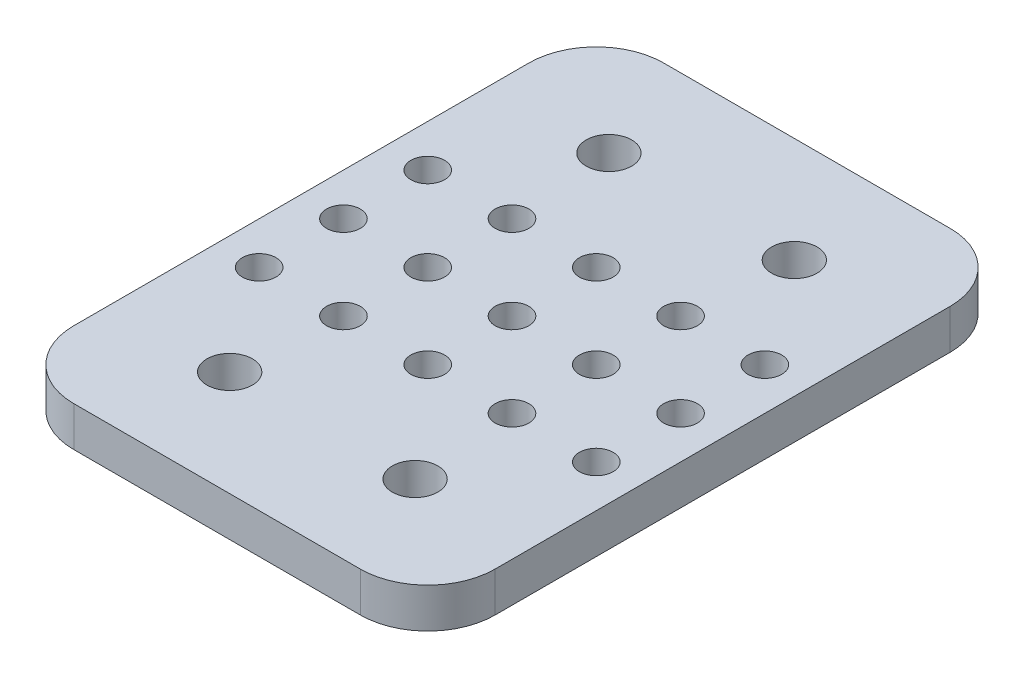
ISO-10303-21;
HEADER;
FILE_DESCRIPTION(('STEP AP214'),'2;1');
FILE_NAME('part.step','',(''),(''),'','','');
FILE_SCHEMA(('AUTOMOTIVE_DESIGN { 1 0 10303 214 1 1 1 1 }'));
ENDSEC;
DATA;
#1=APPLICATION_CONTEXT('core data for automotive mechanical design processes');
#2=APPLICATION_PROTOCOL_DEFINITION('international standard','automotive_design',2000,#1);
#3=PRODUCT_CONTEXT('',#1,'mechanical');
#4=PRODUCT('Part','Part','',(#3));
#5=PRODUCT_RELATED_PRODUCT_CATEGORY('part','',(#4));
#6=PRODUCT_DEFINITION_FORMATION('','',#4);
#7=PRODUCT_DEFINITION_CONTEXT('part definition',#1,'design');
#8=PRODUCT_DEFINITION('design','',#6,#7);
#9=PRODUCT_DEFINITION_SHAPE('','',#8);
#10=(LENGTH_UNIT() NAMED_UNIT(*) SI_UNIT(.MILLI.,.METRE.));
#11=(NAMED_UNIT(*) PLANE_ANGLE_UNIT() SI_UNIT($,.RADIAN.));
#12=(NAMED_UNIT(*) SI_UNIT($,.STERADIAN.) SOLID_ANGLE_UNIT());
#13=UNCERTAINTY_MEASURE_WITH_UNIT(LENGTH_MEASURE(1.E-05),#10,'distance_accuracy_value','');
#14=(GEOMETRIC_REPRESENTATION_CONTEXT(3) GLOBAL_UNCERTAINTY_ASSIGNED_CONTEXT((#13)) GLOBAL_UNIT_ASSIGNED_CONTEXT((#10,
#11,#12)) REPRESENTATION_CONTEXT('',''));
#15=CARTESIAN_POINT('',(0.,0.,0.));
#16=DIRECTION('',(0.,0.,1.));
#17=DIRECTION('',(1.,0.,0.));
#18=AXIS2_PLACEMENT_3D('',#15,#16,#17);
#19=CARTESIAN_POINT('',(0.,6.,0.));
#20=DIRECTION('',(0.,-1.,0.));
#21=DIRECTION('',(0.,0.,-1.));
#22=AXIS2_PLACEMENT_3D('',#19,#20,#21);
#23=PLANE('',#22);
#24=CARTESIAN_POINT('',(44.45,6.,-57.15));
#25=DIRECTION('',(0.,1.,0.));
#26=DIRECTION('',(0.,0.,1.));
#27=AXIS2_PLACEMENT_3D('',#24,#25,#26);
#28=CIRCLE('',#27,2.54);
#29=CARTESIAN_POINT('',(44.45,6.,-54.61));
#30=VERTEX_POINT('',#29);
#31=EDGE_CURVE('E239',#30,#30,#28,.T.);
#32=ORIENTED_EDGE('',*,*,#31,.F.);
#33=EDGE_LOOP('',(#32));
#34=FACE_BOUND('',#33,.T.);
#35=CARTESIAN_POINT('',(44.45,6.,-44.45));
#36=DIRECTION('',(0.,1.,0.));
#37=DIRECTION('',(0.,0.,1.));
#38=AXIS2_PLACEMENT_3D('',#35,#36,#37);
#39=CIRCLE('',#38,2.54);
#40=CARTESIAN_POINT('',(44.45,6.,-41.91));
#41=VERTEX_POINT('',#40);
#42=EDGE_CURVE('E233',#41,#41,#39,.T.);
#43=ORIENTED_EDGE('',*,*,#42,.F.);
#44=EDGE_LOOP('',(#43));
#45=FACE_BOUND('',#44,.T.);
#46=CARTESIAN_POINT('',(57.15,6.,-44.45));
#47=DIRECTION('',(0.,1.,0.));
#48=DIRECTION('',(0.,0.,1.));
#49=AXIS2_PLACEMENT_3D('',#46,#47,#48);
#50=CIRCLE('',#49,2.54);
#51=CARTESIAN_POINT('',(57.15,6.,-41.91));
#52=VERTEX_POINT('',#51);
#53=EDGE_CURVE('E227',#52,#52,#50,.T.);
#54=ORIENTED_EDGE('',*,*,#53,.F.);
#55=EDGE_LOOP('',(#54));
#56=FACE_BOUND('',#55,.T.);
#57=CARTESIAN_POINT('',(57.15,6.,-31.75));
#58=DIRECTION('',(0.,1.,0.));
#59=DIRECTION('',(0.,0.,1.));
#60=AXIS2_PLACEMENT_3D('',#57,#58,#59);
#61=CIRCLE('',#60,2.54);
#62=CARTESIAN_POINT('',(57.15,6.,-29.21));
#63=VERTEX_POINT('',#62);
#64=EDGE_CURVE('E220',#63,#63,#61,.T.);
#65=ORIENTED_EDGE('',*,*,#64,.F.);
#66=EDGE_LOOP('',(#65));
#67=FACE_BOUND('',#66,.T.);
#68=CARTESIAN_POINT('',(44.45,6.,-31.75));
#69=DIRECTION('',(0.,1.,0.));
#70=DIRECTION('',(0.,0.,1.));
#71=AXIS2_PLACEMENT_3D('',#68,#69,#70);
#72=CIRCLE('',#71,2.54);
#73=CARTESIAN_POINT('',(44.45,6.,-29.21));
#74=VERTEX_POINT('',#73);
#75=EDGE_CURVE('E221',#74,#74,#72,.T.);
#76=ORIENTED_EDGE('',*,*,#75,.F.);
#77=EDGE_LOOP('',(#76));
#78=FACE_BOUND('',#77,.T.);
#79=CARTESIAN_POINT('',(57.15,6.,-57.15));
#80=DIRECTION('',(0.,1.,0.));
#81=DIRECTION('',(0.,0.,1.));
#82=AXIS2_PLACEMENT_3D('',#79,#80,#81);
#83=CIRCLE('',#82,2.54);
#84=CARTESIAN_POINT('',(57.15,6.,-54.61));
#85=VERTEX_POINT('',#84);
#86=EDGE_CURVE('E246',#85,#85,#83,.T.);
#87=ORIENTED_EDGE('',*,*,#86,.F.);
#88=EDGE_LOOP('',(#87));
#89=FACE_BOUND('',#88,.T.);
#90=CARTESIAN_POINT('',(6.35,6.,-44.45));
#91=DIRECTION('',(0.,1.,0.));
#92=DIRECTION('',(0.,0.,1.));
#93=AXIS2_PLACEMENT_3D('',#90,#91,#92);
#94=CIRCLE('',#93,2.54);
#95=CARTESIAN_POINT('',(6.35,6.,-41.91));
#96=VERTEX_POINT('',#95);
#97=EDGE_CURVE('E214',#96,#96,#94,.T.);
#98=ORIENTED_EDGE('',*,*,#97,.F.);
#99=EDGE_LOOP('',(#98));
#100=FACE_BOUND('',#99,.T.);
#101=CARTESIAN_POINT('',(6.35,6.,-57.15));
#102=DIRECTION('',(0.,1.,0.));
#103=DIRECTION('',(0.,0.,1.));
#104=AXIS2_PLACEMENT_3D('',#101,#102,#103);
#105=CIRCLE('',#104,2.54);
#106=CARTESIAN_POINT('',(6.35,6.,-54.61));
#107=VERTEX_POINT('',#106);
#108=EDGE_CURVE('E270',#107,#107,#105,.T.);
#109=ORIENTED_EDGE('',*,*,#108,.F.);
#110=EDGE_LOOP('',(#109));
#111=FACE_BOUND('',#110,.T.);
#112=CARTESIAN_POINT('',(19.05,6.,-57.15));
#113=DIRECTION('',(0.,1.,0.));
#114=DIRECTION('',(0.,0.,1.));
#115=AXIS2_PLACEMENT_3D('',#112,#113,#114);
#116=CIRCLE('',#115,2.54);
#117=CARTESIAN_POINT('',(19.05,6.,-54.61));
#118=VERTEX_POINT('',#117);
#119=EDGE_CURVE('E264',#118,#118,#116,.T.);
#120=ORIENTED_EDGE('',*,*,#119,.F.);
#121=EDGE_LOOP('',(#120));
#122=FACE_BOUND('',#121,.T.);
#123=CARTESIAN_POINT('',(19.05,6.,-44.45));
#124=DIRECTION('',(0.,1.,0.));
#125=DIRECTION('',(0.,0.,1.));
#126=AXIS2_PLACEMENT_3D('',#123,#124,#125);
#127=CIRCLE('',#126,2.54);
#128=CARTESIAN_POINT('',(19.05,6.,-41.91));
#129=VERTEX_POINT('',#128);
#130=EDGE_CURVE('E257',#129,#129,#127,.T.);
#131=ORIENTED_EDGE('',*,*,#130,.F.);
#132=EDGE_LOOP('',(#131));
#133=FACE_BOUND('',#132,.T.);
#134=CARTESIAN_POINT('',(19.05,6.,-31.75));
#135=DIRECTION('',(0.,1.,0.));
#136=DIRECTION('',(0.,0.,1.));
#137=AXIS2_PLACEMENT_3D('',#134,#135,#136);
#138=CIRCLE('',#137,2.54);
#139=CARTESIAN_POINT('',(19.05,6.,-29.21));
#140=VERTEX_POINT('',#139);
#141=EDGE_CURVE('E258',#140,#140,#138,.T.);
#142=ORIENTED_EDGE('',*,*,#141,.F.);
#143=EDGE_LOOP('',(#142));
#144=FACE_BOUND('',#143,.T.);
#145=CARTESIAN_POINT('',(31.75,6.,-31.75));
#146=DIRECTION('',(0.,1.,0.));
#147=DIRECTION('',(0.,0.,1.));
#148=AXIS2_PLACEMENT_3D('',#145,#146,#147);
#149=CIRCLE('',#148,2.54);
#150=CARTESIAN_POINT('',(31.75,6.,-29.21));
#151=VERTEX_POINT('',#150);
#152=EDGE_CURVE('E292',#151,#151,#149,.T.);
#153=ORIENTED_EDGE('',*,*,#152,.F.);
#154=EDGE_LOOP('',(#153));
#155=FACE_BOUND('',#154,.T.);
#156=CARTESIAN_POINT('',(31.75,6.,-44.45));
#157=DIRECTION('',(0.,1.,0.));
#158=DIRECTION('',(0.,0.,1.));
#159=AXIS2_PLACEMENT_3D('',#156,#157,#158);
#160=CIRCLE('',#159,2.54);
#161=CARTESIAN_POINT('',(31.75,6.,-41.91));
#162=VERTEX_POINT('',#161);
#163=EDGE_CURVE('E286',#162,#162,#160,.T.);
#164=ORIENTED_EDGE('',*,*,#163,.F.);
#165=EDGE_LOOP('',(#164));
#166=FACE_BOUND('',#165,.T.);
#167=CARTESIAN_POINT('',(31.75,6.,-57.15));
#168=DIRECTION('',(0.,1.,0.));
#169=DIRECTION('',(0.,0.,1.));
#170=AXIS2_PLACEMENT_3D('',#167,#168,#169);
#171=CIRCLE('',#170,2.54);
#172=CARTESIAN_POINT('',(31.75,6.,-54.61));
#173=VERTEX_POINT('',#172);
#174=EDGE_CURVE('E280',#173,#173,#171,.T.);
#175=ORIENTED_EDGE('',*,*,#174,.F.);
#176=EDGE_LOOP('',(#175));
#177=FACE_BOUND('',#176,.T.);
#178=CARTESIAN_POINT('',(6.35,6.,-31.75));
#179=DIRECTION('',(0.,1.,0.));
#180=DIRECTION('',(0.,0.,1.));
#181=AXIS2_PLACEMENT_3D('',#178,#179,#180);
#182=CIRCLE('',#181,2.54);
#183=CARTESIAN_POINT('',(6.35,6.,-29.21));
#184=VERTEX_POINT('',#183);
#185=EDGE_CURVE('E211',#184,#184,#182,.T.);
#186=ORIENTED_EDGE('',*,*,#185,.F.);
#187=EDGE_LOOP('',(#186));
#188=FACE_BOUND('',#187,.T.);
#189=DIRECTION('',(-1.,0.,0.));
#190=VECTOR('',#189,1.);
#191=CARTESIAN_POINT('',(0.,6.,-88.9));
#192=LINE('',#191,#190);
#193=CARTESIAN_POINT('',(53.34,6.,-88.9));
#194=VERTEX_POINT('',#193);
#195=CARTESIAN_POINT('',(10.16,6.,-88.9));
#196=VERTEX_POINT('',#195);
#197=EDGE_CURVE('E145',#194,#196,#192,.T.);
#198=ORIENTED_EDGE('',*,*,#197,.T.);
#199=CARTESIAN_POINT('',(10.16,6.,-78.74));
#200=DIRECTION('',(0.,-1.,0.));
#201=DIRECTION('',(0.,0.,-1.));
#202=AXIS2_PLACEMENT_3D('',#199,#200,#201);
#203=CIRCLE('',#202,10.16);
#204=CARTESIAN_POINT('',(0.,6.,-78.74));
#205=VERTEX_POINT('',#204);
#206=EDGE_CURVE('E164',#196,#205,#203,.F.);
#207=ORIENTED_EDGE('',*,*,#206,.T.);
#208=DIRECTION('',(0.,0.,1.));
#209=VECTOR('',#208,1.);
#210=CARTESIAN_POINT('',(0.,6.,0.));
#211=LINE('',#210,#209);
#212=CARTESIAN_POINT('',(0.,6.,-10.16));
#213=VERTEX_POINT('',#212);
#214=EDGE_CURVE('E128',#205,#213,#211,.T.);
#215=ORIENTED_EDGE('',*,*,#214,.T.);
#216=CARTESIAN_POINT('',(10.16,6.,-10.16));
#217=DIRECTION('',(0.,-1.,0.));
#218=DIRECTION('',(0.,0.,-1.));
#219=AXIS2_PLACEMENT_3D('',#216,#217,#218);
#220=CIRCLE('',#219,10.16);
#221=CARTESIAN_POINT('',(10.16,6.,0.));
#222=VERTEX_POINT('',#221);
#223=EDGE_CURVE('E159',#213,#222,#220,.F.);
#224=ORIENTED_EDGE('',*,*,#223,.T.);
#225=DIRECTION('',(1.,0.,0.));
#226=VECTOR('',#225,1.);
#227=CARTESIAN_POINT('',(0.,6.,0.));
#228=LINE('',#227,#226);
#229=CARTESIAN_POINT('',(53.34,6.,0.));
#230=VERTEX_POINT('',#229);
#231=EDGE_CURVE('E175',#222,#230,#228,.T.);
#232=ORIENTED_EDGE('',*,*,#231,.T.);
#233=CARTESIAN_POINT('',(53.34,6.,-10.16));
#234=DIRECTION('',(0.,-1.,0.));
#235=DIRECTION('',(0.,0.,-1.));
#236=AXIS2_PLACEMENT_3D('',#233,#234,#235);
#237=CIRCLE('',#236,10.16);
#238=CARTESIAN_POINT('',(63.5,6.,-10.16));
#239=VERTEX_POINT('',#238);
#240=EDGE_CURVE('E64',#230,#239,#237,.F.);
#241=ORIENTED_EDGE('',*,*,#240,.T.);
#242=DIRECTION('',(0.,0.,-1.));
#243=VECTOR('',#242,1.);
#244=CARTESIAN_POINT('',(63.5,6.,0.));
#245=LINE('',#244,#243);
#246=CARTESIAN_POINT('',(63.5,6.,-78.74));
#247=VERTEX_POINT('',#246);
#248=EDGE_CURVE('E183',#239,#247,#245,.T.);
#249=ORIENTED_EDGE('',*,*,#248,.T.);
#250=CARTESIAN_POINT('',(53.34,6.,-78.74));
#251=DIRECTION('',(0.,-1.,0.));
#252=DIRECTION('',(0.,0.,-1.));
#253=AXIS2_PLACEMENT_3D('',#250,#251,#252);
#254=CIRCLE('',#253,10.16);
#255=EDGE_CURVE('E162',#247,#194,#254,.F.);
#256=ORIENTED_EDGE('',*,*,#255,.T.);
#257=EDGE_LOOP('',(#198,#207,#215,#224,#232,#241,#249,#256));
#258=FACE_BOUND('',#257,.T.);
#259=CARTESIAN_POINT('',(17.78,6.,-73.025));
#260=DIRECTION('',(0.,1.,0.));
#261=DIRECTION('',(0.,0.,1.));
#262=AXIS2_PLACEMENT_3D('',#259,#260,#261);
#263=CIRCLE('',#262,3.42900000000001);
#264=CARTESIAN_POINT('',(17.78,6.,-69.596));
#265=VERTEX_POINT('',#264);
#266=EDGE_CURVE('E136',#265,#265,#263,.T.);
#267=ORIENTED_EDGE('',*,*,#266,.F.);
#268=EDGE_LOOP('',(#267));
#269=FACE_BOUND('',#268,.T.);
#270=CARTESIAN_POINT('',(45.72,6.,-15.875));
#271=DIRECTION('',(0.,1.,0.));
#272=DIRECTION('',(0.,0.,1.));
#273=AXIS2_PLACEMENT_3D('',#270,#271,#272);
#274=CIRCLE('',#273,3.429);
#275=CARTESIAN_POINT('',(45.72,6.,-12.446));
#276=VERTEX_POINT('',#275);
#277=EDGE_CURVE('E191',#276,#276,#274,.T.);
#278=ORIENTED_EDGE('',*,*,#277,.F.);
#279=EDGE_LOOP('',(#278));
#280=FACE_BOUND('',#279,.T.);
#281=CARTESIAN_POINT('',(17.78,6.,-15.875));
#282=DIRECTION('',(0.,1.,0.));
#283=DIRECTION('',(0.,0.,-1.));
#284=AXIS2_PLACEMENT_3D('',#281,#282,#283);
#285=CIRCLE('',#284,3.429);
#286=CARTESIAN_POINT('',(17.78,6.,-19.304));
#287=VERTEX_POINT('',#286);
#288=EDGE_CURVE('E196',#287,#287,#285,.T.);
#289=ORIENTED_EDGE('',*,*,#288,.F.);
#290=EDGE_LOOP('',(#289));
#291=FACE_BOUND('',#290,.T.);
#292=CARTESIAN_POINT('',(45.72,6.,-73.025));
#293=DIRECTION('',(0.,1.,0.));
#294=DIRECTION('',(0.,0.,-1.));
#295=AXIS2_PLACEMENT_3D('',#292,#293,#294);
#296=CIRCLE('',#295,3.42900000000001);
#297=CARTESIAN_POINT('',(45.72,6.,-76.454));
#298=VERTEX_POINT('',#297);
#299=EDGE_CURVE('E202',#298,#298,#296,.T.);
#300=ORIENTED_EDGE('',*,*,#299,.F.);
#301=EDGE_LOOP('',(#300));
#302=FACE_BOUND('',#301,.T.);
#303=ADVANCED_FACE('F42',(#34,#45,#56,#67,#78,#89,#100,#111,#122,#133,#144,#155,#166,#177,#188,
#258,#269,#280,#291,#302),#23,.F.);
#304=CARTESIAN_POINT('',(0.,0.,0.));
#305=DIRECTION('',(0.,-1.,0.));
#306=DIRECTION('',(0.,0.,-1.));
#307=AXIS2_PLACEMENT_3D('',#304,#305,#306);
#308=PLANE('',#307);
#309=CARTESIAN_POINT('',(44.45,0.,-57.15));
#310=DIRECTION('',(0.,1.,0.));
#311=DIRECTION('',(0.,0.,1.));
#312=AXIS2_PLACEMENT_3D('',#309,#310,#311);
#313=CIRCLE('',#312,2.54);
#314=CARTESIAN_POINT('',(44.45,0.,-54.61));
#315=VERTEX_POINT('',#314);
#316=EDGE_CURVE('E236',#315,#315,#313,.T.);
#317=ORIENTED_EDGE('',*,*,#316,.T.);
#318=EDGE_LOOP('',(#317));
#319=FACE_BOUND('',#318,.T.);
#320=CARTESIAN_POINT('',(44.45,0.,-44.45));
#321=DIRECTION('',(0.,1.,0.));
#322=DIRECTION('',(0.,0.,1.));
#323=AXIS2_PLACEMENT_3D('',#320,#321,#322);
#324=CIRCLE('',#323,2.54);
#325=CARTESIAN_POINT('',(44.45,0.,-41.91));
#326=VERTEX_POINT('',#325);
#327=EDGE_CURVE('E230',#326,#326,#324,.T.);
#328=ORIENTED_EDGE('',*,*,#327,.T.);
#329=EDGE_LOOP('',(#328));
#330=FACE_BOUND('',#329,.T.);
#331=CARTESIAN_POINT('',(57.15,0.,-44.45));
#332=DIRECTION('',(0.,1.,0.));
#333=DIRECTION('',(0.,0.,1.));
#334=AXIS2_PLACEMENT_3D('',#331,#332,#333);
#335=CIRCLE('',#334,2.54);
#336=CARTESIAN_POINT('',(57.15,0.,-41.91));
#337=VERTEX_POINT('',#336);
#338=EDGE_CURVE('E224',#337,#337,#335,.T.);
#339=ORIENTED_EDGE('',*,*,#338,.T.);
#340=EDGE_LOOP('',(#339));
#341=FACE_BOUND('',#340,.T.);
#342=CARTESIAN_POINT('',(57.15,0.,-31.75));
#343=DIRECTION('',(0.,1.,0.));
#344=DIRECTION('',(0.,0.,1.));
#345=AXIS2_PLACEMENT_3D('',#342,#343,#344);
#346=CIRCLE('',#345,2.54);
#347=CARTESIAN_POINT('',(57.15,0.,-29.21));
#348=VERTEX_POINT('',#347);
#349=EDGE_CURVE('E217',#348,#348,#346,.T.);
#350=ORIENTED_EDGE('',*,*,#349,.T.);
#351=EDGE_LOOP('',(#350));
#352=FACE_BOUND('',#351,.T.);
#353=CARTESIAN_POINT('',(44.45,0.,-31.75));
#354=DIRECTION('',(0.,1.,0.));
#355=DIRECTION('',(0.,0.,1.));
#356=AXIS2_PLACEMENT_3D('',#353,#354,#355);
#357=CIRCLE('',#356,2.54);
#358=CARTESIAN_POINT('',(44.45,0.,-29.21));
#359=VERTEX_POINT('',#358);
#360=EDGE_CURVE('E249',#359,#359,#357,.T.);
#361=ORIENTED_EDGE('',*,*,#360,.T.);
#362=EDGE_LOOP('',(#361));
#363=FACE_BOUND('',#362,.T.);
#364=CARTESIAN_POINT('',(57.15,0.,-57.15));
#365=DIRECTION('',(0.,1.,0.));
#366=DIRECTION('',(0.,0.,1.));
#367=AXIS2_PLACEMENT_3D('',#364,#365,#366);
#368=CIRCLE('',#367,2.54);
#369=CARTESIAN_POINT('',(57.15,0.,-54.61));
#370=VERTEX_POINT('',#369);
#371=EDGE_CURVE('E243',#370,#370,#368,.T.);
#372=ORIENTED_EDGE('',*,*,#371,.T.);
#373=EDGE_LOOP('',(#372));
#374=FACE_BOUND('',#373,.T.);
#375=CARTESIAN_POINT('',(6.35,0.,-44.45));
#376=DIRECTION('',(0.,1.,0.));
#377=DIRECTION('',(0.,0.,1.));
#378=AXIS2_PLACEMENT_3D('',#375,#376,#377);
#379=CIRCLE('',#378,2.54);
#380=CARTESIAN_POINT('',(6.35,0.,-41.91));
#381=VERTEX_POINT('',#380);
#382=EDGE_CURVE('E273',#381,#381,#379,.T.);
#383=ORIENTED_EDGE('',*,*,#382,.T.);
#384=EDGE_LOOP('',(#383));
#385=FACE_BOUND('',#384,.T.);
#386=CARTESIAN_POINT('',(6.35,0.,-57.15));
#387=DIRECTION('',(0.,1.,0.));
#388=DIRECTION('',(0.,0.,1.));
#389=AXIS2_PLACEMENT_3D('',#386,#387,#388);
#390=CIRCLE('',#389,2.54);
#391=CARTESIAN_POINT('',(6.35,0.,-54.61));
#392=VERTEX_POINT('',#391);
#393=EDGE_CURVE('E267',#392,#392,#390,.T.);
#394=ORIENTED_EDGE('',*,*,#393,.T.);
#395=EDGE_LOOP('',(#394));
#396=FACE_BOUND('',#395,.T.);
#397=CARTESIAN_POINT('',(19.05,0.,-57.15));
#398=DIRECTION('',(0.,1.,0.));
#399=DIRECTION('',(0.,0.,1.));
#400=AXIS2_PLACEMENT_3D('',#397,#398,#399);
#401=CIRCLE('',#400,2.54);
#402=CARTESIAN_POINT('',(19.05,0.,-54.61));
#403=VERTEX_POINT('',#402);
#404=EDGE_CURVE('E261',#403,#403,#401,.T.);
#405=ORIENTED_EDGE('',*,*,#404,.T.);
#406=EDGE_LOOP('',(#405));
#407=FACE_BOUND('',#406,.T.);
#408=CARTESIAN_POINT('',(19.05,0.,-44.45));
#409=DIRECTION('',(0.,1.,0.));
#410=DIRECTION('',(0.,0.,1.));
#411=AXIS2_PLACEMENT_3D('',#408,#409,#410);
#412=CIRCLE('',#411,2.54);
#413=CARTESIAN_POINT('',(19.05,0.,-41.91));
#414=VERTEX_POINT('',#413);
#415=EDGE_CURVE('E254',#414,#414,#412,.T.);
#416=ORIENTED_EDGE('',*,*,#415,.T.);
#417=EDGE_LOOP('',(#416));
#418=FACE_BOUND('',#417,.T.);
#419=CARTESIAN_POINT('',(19.05,0.,-31.75));
#420=DIRECTION('',(0.,1.,0.));
#421=DIRECTION('',(0.,0.,1.));
#422=AXIS2_PLACEMENT_3D('',#419,#420,#421);
#423=CIRCLE('',#422,2.54);
#424=CARTESIAN_POINT('',(19.05,0.,-29.21));
#425=VERTEX_POINT('',#424);
#426=EDGE_CURVE('E295',#425,#425,#423,.T.);
#427=ORIENTED_EDGE('',*,*,#426,.T.);
#428=EDGE_LOOP('',(#427));
#429=FACE_BOUND('',#428,.T.);
#430=CARTESIAN_POINT('',(31.75,0.,-31.75));
#431=DIRECTION('',(0.,1.,0.));
#432=DIRECTION('',(0.,0.,1.));
#433=AXIS2_PLACEMENT_3D('',#430,#431,#432);
#434=CIRCLE('',#433,2.54);
#435=CARTESIAN_POINT('',(31.75,0.,-29.21));
#436=VERTEX_POINT('',#435);
#437=EDGE_CURVE('E289',#436,#436,#434,.T.);
#438=ORIENTED_EDGE('',*,*,#437,.T.);
#439=EDGE_LOOP('',(#438));
#440=FACE_BOUND('',#439,.T.);
#441=CARTESIAN_POINT('',(31.75,0.,-44.45));
#442=DIRECTION('',(0.,1.,0.));
#443=DIRECTION('',(0.,0.,1.));
#444=AXIS2_PLACEMENT_3D('',#441,#442,#443);
#445=CIRCLE('',#444,2.54);
#446=CARTESIAN_POINT('',(31.75,0.,-41.91));
#447=VERTEX_POINT('',#446);
#448=EDGE_CURVE('E283',#447,#447,#445,.T.);
#449=ORIENTED_EDGE('',*,*,#448,.T.);
#450=EDGE_LOOP('',(#449));
#451=FACE_BOUND('',#450,.T.);
#452=CARTESIAN_POINT('',(31.75,0.,-57.15));
#453=DIRECTION('',(0.,1.,0.));
#454=DIRECTION('',(0.,0.,1.));
#455=AXIS2_PLACEMENT_3D('',#452,#453,#454);
#456=CIRCLE('',#455,2.54);
#457=CARTESIAN_POINT('',(31.75,0.,-54.61));
#458=VERTEX_POINT('',#457);
#459=EDGE_CURVE('E242',#458,#458,#456,.T.);
#460=ORIENTED_EDGE('',*,*,#459,.T.);
#461=EDGE_LOOP('',(#460));
#462=FACE_BOUND('',#461,.T.);
#463=CARTESIAN_POINT('',(6.35,0.,-31.75));
#464=DIRECTION('',(0.,1.,0.));
#465=DIRECTION('',(0.,0.,1.));
#466=AXIS2_PLACEMENT_3D('',#463,#464,#465);
#467=CIRCLE('',#466,2.54);
#468=CARTESIAN_POINT('',(6.35,0.,-29.21));
#469=VERTEX_POINT('',#468);
#470=EDGE_CURVE('E208',#469,#469,#467,.T.);
#471=ORIENTED_EDGE('',*,*,#470,.T.);
#472=EDGE_LOOP('',(#471));
#473=FACE_BOUND('',#472,.T.);
#474=CARTESIAN_POINT('',(17.78,0.,-15.875));
#475=DIRECTION('',(0.,1.,0.));
#476=DIRECTION('',(0.,0.,-1.));
#477=AXIS2_PLACEMENT_3D('',#474,#475,#476);
#478=CIRCLE('',#477,3.429);
#479=CARTESIAN_POINT('',(17.78,0.,-19.304));
#480=VERTEX_POINT('',#479);
#481=EDGE_CURVE('E199',#480,#480,#478,.T.);
#482=ORIENTED_EDGE('',*,*,#481,.T.);
#483=EDGE_LOOP('',(#482));
#484=FACE_BOUND('',#483,.T.);
#485=CARTESIAN_POINT('',(17.78,0.,-73.025));
#486=DIRECTION('',(0.,1.,0.));
#487=DIRECTION('',(0.,0.,1.));
#488=AXIS2_PLACEMENT_3D('',#485,#486,#487);
#489=CIRCLE('',#488,3.42900000000001);
#490=CARTESIAN_POINT('',(17.78,0.,-69.596));
#491=VERTEX_POINT('',#490);
#492=EDGE_CURVE('E142',#491,#491,#489,.T.);
#493=ORIENTED_EDGE('',*,*,#492,.T.);
#494=EDGE_LOOP('',(#493));
#495=FACE_BOUND('',#494,.T.);
#496=DIRECTION('',(0.,0.,1.));
#497=VECTOR('',#496,1.);
#498=CARTESIAN_POINT('',(0.,0.,0.));
#499=LINE('',#498,#497);
#500=CARTESIAN_POINT('',(0.,0.,-78.74));
#501=VERTEX_POINT('',#500);
#502=CARTESIAN_POINT('',(0.,0.,-10.16));
#503=VERTEX_POINT('',#502);
#504=EDGE_CURVE('E125',#501,#503,#499,.T.);
#505=ORIENTED_EDGE('',*,*,#504,.F.);
#506=CARTESIAN_POINT('',(10.16,0.,-78.74));
#507=DIRECTION('',(0.,-1.,0.));
#508=DIRECTION('',(0.,0.,-1.));
#509=AXIS2_PLACEMENT_3D('',#506,#507,#508);
#510=CIRCLE('',#509,10.16);
#511=CARTESIAN_POINT('',(10.16,0.,-88.9));
#512=VERTEX_POINT('',#511);
#513=EDGE_CURVE('E108',#501,#512,#510,.T.);
#514=ORIENTED_EDGE('',*,*,#513,.T.);
#515=DIRECTION('',(-1.,0.,0.));
#516=VECTOR('',#515,1.);
#517=CARTESIAN_POINT('',(0.,0.,-88.9));
#518=LINE('',#517,#516);
#519=CARTESIAN_POINT('',(53.34,0.,-88.9));
#520=VERTEX_POINT('',#519);
#521=EDGE_CURVE('E149',#520,#512,#518,.T.);
#522=ORIENTED_EDGE('',*,*,#521,.F.);
#523=CARTESIAN_POINT('',(53.34,0.,-78.74));
#524=DIRECTION('',(0.,-1.,0.));
#525=DIRECTION('',(0.,0.,-1.));
#526=AXIS2_PLACEMENT_3D('',#523,#524,#525);
#527=CIRCLE('',#526,10.16);
#528=CARTESIAN_POINT('',(63.5,0.,-78.74));
#529=VERTEX_POINT('',#528);
#530=EDGE_CURVE('E119',#520,#529,#527,.T.);
#531=ORIENTED_EDGE('',*,*,#530,.T.);
#532=DIRECTION('',(0.,0.,-1.));
#533=VECTOR('',#532,1.);
#534=CARTESIAN_POINT('',(63.5,0.,0.));
#535=LINE('',#534,#533);
#536=CARTESIAN_POINT('',(63.5,0.,-10.16));
#537=VERTEX_POINT('',#536);
#538=EDGE_CURVE('E139',#537,#529,#535,.T.);
#539=ORIENTED_EDGE('',*,*,#538,.F.);
#540=CARTESIAN_POINT('',(53.34,0.,-10.16));
#541=DIRECTION('',(0.,-1.,0.));
#542=DIRECTION('',(0.,0.,-1.));
#543=AXIS2_PLACEMENT_3D('',#540,#541,#542);
#544=CIRCLE('',#543,10.16);
#545=CARTESIAN_POINT('',(53.34,0.,0.));
#546=VERTEX_POINT('',#545);
#547=EDGE_CURVE('E153',#537,#546,#544,.T.);
#548=ORIENTED_EDGE('',*,*,#547,.T.);
#549=DIRECTION('',(1.,0.,0.));
#550=VECTOR('',#549,1.);
#551=CARTESIAN_POINT('',(0.,0.,0.));
#552=LINE('',#551,#550);
#553=CARTESIAN_POINT('',(10.16,0.,0.));
#554=VERTEX_POINT('',#553);
#555=EDGE_CURVE('E135',#554,#546,#552,.T.);
#556=ORIENTED_EDGE('',*,*,#555,.F.);
#557=CARTESIAN_POINT('',(10.16,0.,-10.16));
#558=DIRECTION('',(0.,-1.,0.));
#559=DIRECTION('',(0.,0.,-1.));
#560=AXIS2_PLACEMENT_3D('',#557,#558,#559);
#561=CIRCLE('',#560,10.16);
#562=EDGE_CURVE('E129',#554,#503,#561,.T.);
#563=ORIENTED_EDGE('',*,*,#562,.T.);
#564=EDGE_LOOP('',(#505,#514,#522,#531,#539,#548,#556,#563));
#565=FACE_BOUND('',#564,.T.);
#566=CARTESIAN_POINT('',(45.72,0.,-15.875));
#567=DIRECTION('',(0.,1.,0.));
#568=DIRECTION('',(0.,0.,1.));
#569=AXIS2_PLACEMENT_3D('',#566,#567,#568);
#570=CIRCLE('',#569,3.429);
#571=CARTESIAN_POINT('',(45.72,0.,-12.446));
#572=VERTEX_POINT('',#571);
#573=EDGE_CURVE('E193',#572,#572,#570,.T.);
#574=ORIENTED_EDGE('',*,*,#573,.T.);
#575=EDGE_LOOP('',(#574));
#576=FACE_BOUND('',#575,.T.);
#577=CARTESIAN_POINT('',(45.72,0.,-73.025));
#578=DIRECTION('',(0.,1.,0.));
#579=DIRECTION('',(0.,0.,-1.));
#580=AXIS2_PLACEMENT_3D('',#577,#578,#579);
#581=CIRCLE('',#580,3.42900000000001);
#582=CARTESIAN_POINT('',(45.72,0.,-76.454));
#583=VERTEX_POINT('',#582);
#584=EDGE_CURVE('E205',#583,#583,#581,.T.);
#585=ORIENTED_EDGE('',*,*,#584,.T.);
#586=EDGE_LOOP('',(#585));
#587=FACE_BOUND('',#586,.T.);
#588=ADVANCED_FACE('F132',(#319,#330,#341,#352,#363,#374,#385,#396,#407,#418,#429,#440,#451,
#462,#473,#484,#495,#565,#576,#587),#308,.T.);
#589=CARTESIAN_POINT('',(0.,6.,0.));
#590=DIRECTION('',(1.,0.,0.));
#591=DIRECTION('',(0.,0.,-1.));
#592=AXIS2_PLACEMENT_3D('',#589,#590,#591);
#593=PLANE('',#592);
#594=ORIENTED_EDGE('',*,*,#214,.F.);
#595=DIRECTION('',(0.,-1.,0.));
#596=VECTOR('',#595,1.);
#597=CARTESIAN_POINT('',(0.,6.,-78.74));
#598=LINE('',#597,#596);
#599=EDGE_CURVE('E112',#205,#501,#598,.T.);
#600=ORIENTED_EDGE('',*,*,#599,.T.);
#601=ORIENTED_EDGE('',*,*,#504,.T.);
#602=DIRECTION('',(0.,-1.,0.));
#603=VECTOR('',#602,1.);
#604=CARTESIAN_POINT('',(0.,6.,-10.16));
#605=LINE('',#604,#603);
#606=EDGE_CURVE('E130',#503,#213,#605,.F.);
#607=ORIENTED_EDGE('',*,*,#606,.T.);
#608=EDGE_LOOP('',(#594,#600,#601,#607));
#609=FACE_BOUND('',#608,.T.);
#610=ADVANCED_FACE('F124',(#609),#593,.F.);
#611=CARTESIAN_POINT('',(0.,6.,0.));
#612=DIRECTION('',(0.,0.,-1.));
#613=DIRECTION('',(-1.,0.,0.));
#614=AXIS2_PLACEMENT_3D('',#611,#612,#613);
#615=PLANE('',#614);
#616=ORIENTED_EDGE('',*,*,#555,.T.);
#617=DIRECTION('',(0.,-1.,0.));
#618=VECTOR('',#617,1.);
#619=CARTESIAN_POINT('',(53.34,6.,0.));
#620=LINE('',#619,#618);
#621=EDGE_CURVE('E12',#546,#230,#620,.F.);
#622=ORIENTED_EDGE('',*,*,#621,.T.);
#623=ORIENTED_EDGE('',*,*,#231,.F.);
#624=DIRECTION('',(0.,-1.,0.));
#625=VECTOR('',#624,1.);
#626=CARTESIAN_POINT('',(10.16,6.,0.));
#627=LINE('',#626,#625);
#628=EDGE_CURVE('E50',#222,#554,#627,.T.);
#629=ORIENTED_EDGE('',*,*,#628,.T.);
#630=EDGE_LOOP('',(#616,#622,#623,#629));
#631=FACE_BOUND('',#630,.T.);
#632=ADVANCED_FACE('F173',(#631),#615,.F.);
#633=CARTESIAN_POINT('',(63.5,6.,0.));
#634=DIRECTION('',(-1.,0.,0.));
#635=DIRECTION('',(0.,0.,1.));
#636=AXIS2_PLACEMENT_3D('',#633,#634,#635);
#637=PLANE('',#636);
#638=ORIENTED_EDGE('',*,*,#538,.T.);
#639=DIRECTION('',(0.,-1.,0.));
#640=VECTOR('',#639,1.);
#641=CARTESIAN_POINT('',(63.5,6.,-78.74));
#642=LINE('',#641,#640);
#643=EDGE_CURVE('E57',#529,#247,#642,.F.);
#644=ORIENTED_EDGE('',*,*,#643,.T.);
#645=ORIENTED_EDGE('',*,*,#248,.F.);
#646=DIRECTION('',(0.,-1.,0.));
#647=VECTOR('',#646,1.);
#648=CARTESIAN_POINT('',(63.5,6.,-10.16));
#649=LINE('',#648,#647);
#650=EDGE_CURVE('E166',#239,#537,#649,.T.);
#651=ORIENTED_EDGE('',*,*,#650,.T.);
#652=EDGE_LOOP('',(#638,#644,#645,#651));
#653=FACE_BOUND('',#652,.T.);
#654=ADVANCED_FACE('F182',(#653),#637,.F.);
#655=CARTESIAN_POINT('',(0.,6.,-88.9));
#656=DIRECTION('',(0.,0.,1.));
#657=DIRECTION('',(1.,0.,0.));
#658=AXIS2_PLACEMENT_3D('',#655,#656,#657);
#659=PLANE('',#658);
#660=ORIENTED_EDGE('',*,*,#521,.T.);
#661=DIRECTION('',(0.,-1.,0.));
#662=VECTOR('',#661,1.);
#663=CARTESIAN_POINT('',(10.16,6.,-88.9));
#664=LINE('',#663,#662);
#665=EDGE_CURVE('E113',#512,#196,#664,.F.);
#666=ORIENTED_EDGE('',*,*,#665,.T.);
#667=ORIENTED_EDGE('',*,*,#197,.F.);
#668=DIRECTION('',(0.,-1.,0.));
#669=VECTOR('',#668,1.);
#670=CARTESIAN_POINT('',(53.34,6.,-88.9));
#671=LINE('',#670,#669);
#672=EDGE_CURVE('E118',#194,#520,#671,.T.);
#673=ORIENTED_EDGE('',*,*,#672,.T.);
#674=EDGE_LOOP('',(#660,#666,#667,#673));
#675=FACE_BOUND('',#674,.T.);
#676=ADVANCED_FACE('F341',(#675),#659,.F.);
#677=CARTESIAN_POINT('',(17.78,6.,-73.025));
#678=DIRECTION('',(0.,-1.,0.));
#679=DIRECTION('',(0.,0.,-1.));
#680=AXIS2_PLACEMENT_3D('',#677,#678,#679);
#681=CYLINDRICAL_SURFACE('',#680,3.42900000000001);
#682=ORIENTED_EDGE('',*,*,#266,.T.);
#683=EDGE_LOOP('',(#682));
#684=FACE_BOUND('',#683,.T.);
#685=ORIENTED_EDGE('',*,*,#492,.F.);
#686=EDGE_LOOP('',(#685));
#687=FACE_BOUND('',#686,.T.);
#688=ADVANCED_FACE('F344',(#684,#687),#681,.F.);
#689=CARTESIAN_POINT('',(45.72,6.,-15.875));
#690=DIRECTION('',(0.,-1.,0.));
#691=DIRECTION('',(0.,0.,-1.));
#692=AXIS2_PLACEMENT_3D('',#689,#690,#691);
#693=CYLINDRICAL_SURFACE('',#692,3.429);
#694=ORIENTED_EDGE('',*,*,#277,.T.);
#695=EDGE_LOOP('',(#694));
#696=FACE_BOUND('',#695,.T.);
#697=ORIENTED_EDGE('',*,*,#573,.F.);
#698=EDGE_LOOP('',(#697));
#699=FACE_BOUND('',#698,.T.);
#700=ADVANCED_FACE('F381',(#696,#699),#693,.F.);
#701=CARTESIAN_POINT('',(17.78,6.,-15.875));
#702=DIRECTION('',(0.,-1.,0.));
#703=DIRECTION('',(0.,0.,-1.));
#704=AXIS2_PLACEMENT_3D('',#701,#702,#703);
#705=CYLINDRICAL_SURFACE('',#704,3.429);
#706=ORIENTED_EDGE('',*,*,#288,.T.);
#707=EDGE_LOOP('',(#706));
#708=FACE_BOUND('',#707,.T.);
#709=ORIENTED_EDGE('',*,*,#481,.F.);
#710=EDGE_LOOP('',(#709));
#711=FACE_BOUND('',#710,.T.);
#712=ADVANCED_FACE('F327',(#708,#711),#705,.F.);
#713=CARTESIAN_POINT('',(45.72,6.,-73.025));
#714=DIRECTION('',(0.,-1.,0.));
#715=DIRECTION('',(0.,0.,-1.));
#716=AXIS2_PLACEMENT_3D('',#713,#714,#715);
#717=CYLINDRICAL_SURFACE('',#716,3.42900000000001);
#718=ORIENTED_EDGE('',*,*,#299,.T.);
#719=EDGE_LOOP('',(#718));
#720=FACE_BOUND('',#719,.T.);
#721=ORIENTED_EDGE('',*,*,#584,.F.);
#722=EDGE_LOOP('',(#721));
#723=FACE_BOUND('',#722,.T.);
#724=ADVANCED_FACE('F324',(#720,#723),#717,.F.);
#725=CARTESIAN_POINT('',(10.16,6.,-78.74));
#726=DIRECTION('',(0.,-1.,0.));
#727=DIRECTION('',(0.,0.,-1.));
#728=AXIS2_PLACEMENT_3D('',#725,#726,#727);
#729=CYLINDRICAL_SURFACE('',#728,10.16);
#730=ORIENTED_EDGE('',*,*,#206,.F.);
#731=ORIENTED_EDGE('',*,*,#665,.F.);
#732=ORIENTED_EDGE('',*,*,#513,.F.);
#733=ORIENTED_EDGE('',*,*,#599,.F.);
#734=EDGE_LOOP('',(#730,#731,#732,#733));
#735=FACE_BOUND('',#734,.T.);
#736=ADVANCED_FACE('F111',(#735),#729,.T.);
#737=CARTESIAN_POINT('',(53.34,6.,-78.74));
#738=DIRECTION('',(0.,-1.,0.));
#739=DIRECTION('',(0.,0.,-1.));
#740=AXIS2_PLACEMENT_3D('',#737,#738,#739);
#741=CYLINDRICAL_SURFACE('',#740,10.16);
#742=ORIENTED_EDGE('',*,*,#255,.F.);
#743=ORIENTED_EDGE('',*,*,#643,.F.);
#744=ORIENTED_EDGE('',*,*,#530,.F.);
#745=ORIENTED_EDGE('',*,*,#672,.F.);
#746=EDGE_LOOP('',(#742,#743,#744,#745));
#747=FACE_BOUND('',#746,.T.);
#748=ADVANCED_FACE('F352',(#747),#741,.T.);
#749=CARTESIAN_POINT('',(53.34,6.,-10.16));
#750=DIRECTION('',(0.,-1.,0.));
#751=DIRECTION('',(0.,0.,-1.));
#752=AXIS2_PLACEMENT_3D('',#749,#750,#751);
#753=CYLINDRICAL_SURFACE('',#752,10.16);
#754=ORIENTED_EDGE('',*,*,#240,.F.);
#755=ORIENTED_EDGE('',*,*,#621,.F.);
#756=ORIENTED_EDGE('',*,*,#547,.F.);
#757=ORIENTED_EDGE('',*,*,#650,.F.);
#758=EDGE_LOOP('',(#754,#755,#756,#757));
#759=FACE_BOUND('',#758,.T.);
#760=ADVANCED_FACE('F181',(#759),#753,.T.);
#761=CARTESIAN_POINT('',(10.16,6.,-10.16));
#762=DIRECTION('',(0.,-1.,0.));
#763=DIRECTION('',(0.,0.,-1.));
#764=AXIS2_PLACEMENT_3D('',#761,#762,#763);
#765=CYLINDRICAL_SURFACE('',#764,10.16);
#766=ORIENTED_EDGE('',*,*,#223,.F.);
#767=ORIENTED_EDGE('',*,*,#606,.F.);
#768=ORIENTED_EDGE('',*,*,#562,.F.);
#769=ORIENTED_EDGE('',*,*,#628,.F.);
#770=EDGE_LOOP('',(#766,#767,#768,#769));
#771=FACE_BOUND('',#770,.T.);
#772=ADVANCED_FACE('F44',(#771),#765,.T.);
#773=CARTESIAN_POINT('',(6.35,0.,-31.75));
#774=DIRECTION('',(0.,1.,0.));
#775=DIRECTION('',(0.,0.,1.));
#776=AXIS2_PLACEMENT_3D('',#773,#774,#775);
#777=CYLINDRICAL_SURFACE('',#776,2.54);
#778=ORIENTED_EDGE('',*,*,#470,.F.);
#779=EDGE_LOOP('',(#778));
#780=FACE_BOUND('',#779,.T.);
#781=ORIENTED_EDGE('',*,*,#185,.T.);
#782=EDGE_LOOP('',(#781));
#783=FACE_BOUND('',#782,.T.);
#784=ADVANCED_FACE('F359',(#780,#783),#777,.F.);
#785=CARTESIAN_POINT('',(31.75,0.,-57.15));
#786=DIRECTION('',(0.,1.,0.));
#787=DIRECTION('',(0.,0.,1.));
#788=AXIS2_PLACEMENT_3D('',#785,#786,#787);
#789=CYLINDRICAL_SURFACE('',#788,2.54);
#790=ORIENTED_EDGE('',*,*,#459,.F.);
#791=EDGE_LOOP('',(#790));
#792=FACE_BOUND('',#791,.T.);
#793=ORIENTED_EDGE('',*,*,#174,.T.);
#794=EDGE_LOOP('',(#793));
#795=FACE_BOUND('',#794,.T.);
#796=ADVANCED_FACE('F364',(#792,#795),#789,.F.);
#797=CARTESIAN_POINT('',(31.75,0.,-44.45));
#798=DIRECTION('',(0.,1.,0.));
#799=DIRECTION('',(0.,0.,1.));
#800=AXIS2_PLACEMENT_3D('',#797,#798,#799);
#801=CYLINDRICAL_SURFACE('',#800,2.54);
#802=ORIENTED_EDGE('',*,*,#448,.F.);
#803=EDGE_LOOP('',(#802));
#804=FACE_BOUND('',#803,.T.);
#805=ORIENTED_EDGE('',*,*,#163,.T.);
#806=EDGE_LOOP('',(#805));
#807=FACE_BOUND('',#806,.T.);
#808=ADVANCED_FACE('F370',(#804,#807),#801,.F.);
#809=CARTESIAN_POINT('',(31.75,0.,-31.75));
#810=DIRECTION('',(0.,1.,0.));
#811=DIRECTION('',(0.,0.,1.));
#812=AXIS2_PLACEMENT_3D('',#809,#810,#811);
#813=CYLINDRICAL_SURFACE('',#812,2.54);
#814=ORIENTED_EDGE('',*,*,#437,.F.);
#815=EDGE_LOOP('',(#814));
#816=FACE_BOUND('',#815,.T.);
#817=ORIENTED_EDGE('',*,*,#152,.T.);
#818=EDGE_LOOP('',(#817));
#819=FACE_BOUND('',#818,.T.);
#820=ADVANCED_FACE('F455',(#816,#819),#813,.F.);
#821=CARTESIAN_POINT('',(19.05,0.,-31.75));
#822=DIRECTION('',(0.,1.,0.));
#823=DIRECTION('',(0.,0.,1.));
#824=AXIS2_PLACEMENT_3D('',#821,#822,#823);
#825=CYLINDRICAL_SURFACE('',#824,2.54);
#826=ORIENTED_EDGE('',*,*,#426,.F.);
#827=EDGE_LOOP('',(#826));
#828=FACE_BOUND('',#827,.T.);
#829=ORIENTED_EDGE('',*,*,#141,.T.);
#830=EDGE_LOOP('',(#829));
#831=FACE_BOUND('',#830,.T.);
#832=ADVANCED_FACE('F301',(#828,#831),#825,.F.);
#833=CARTESIAN_POINT('',(19.05,0.,-44.45));
#834=DIRECTION('',(0.,1.,0.));
#835=DIRECTION('',(0.,0.,1.));
#836=AXIS2_PLACEMENT_3D('',#833,#834,#835);
#837=CYLINDRICAL_SURFACE('',#836,2.54);
#838=ORIENTED_EDGE('',*,*,#415,.F.);
#839=EDGE_LOOP('',(#838));
#840=FACE_BOUND('',#839,.T.);
#841=ORIENTED_EDGE('',*,*,#130,.T.);
#842=EDGE_LOOP('',(#841));
#843=FACE_BOUND('',#842,.T.);
#844=ADVANCED_FACE('F475',(#840,#843),#837,.F.);
#845=CARTESIAN_POINT('',(19.05,0.,-57.15));
#846=DIRECTION('',(0.,1.,0.));
#847=DIRECTION('',(0.,0.,1.));
#848=AXIS2_PLACEMENT_3D('',#845,#846,#847);
#849=CYLINDRICAL_SURFACE('',#848,2.54);
#850=ORIENTED_EDGE('',*,*,#404,.F.);
#851=EDGE_LOOP('',(#850));
#852=FACE_BOUND('',#851,.T.);
#853=ORIENTED_EDGE('',*,*,#119,.T.);
#854=EDGE_LOOP('',(#853));
#855=FACE_BOUND('',#854,.T.);
#856=ADVANCED_FACE('F486',(#852,#855),#849,.F.);
#857=CARTESIAN_POINT('',(6.35,0.,-57.15));
#858=DIRECTION('',(0.,1.,0.));
#859=DIRECTION('',(0.,0.,1.));
#860=AXIS2_PLACEMENT_3D('',#857,#858,#859);
#861=CYLINDRICAL_SURFACE('',#860,2.54);
#862=ORIENTED_EDGE('',*,*,#393,.F.);
#863=EDGE_LOOP('',(#862));
#864=FACE_BOUND('',#863,.T.);
#865=ORIENTED_EDGE('',*,*,#108,.T.);
#866=EDGE_LOOP('',(#865));
#867=FACE_BOUND('',#866,.T.);
#868=ADVANCED_FACE('F395',(#864,#867),#861,.F.);
#869=CARTESIAN_POINT('',(6.35,0.,-44.45));
#870=DIRECTION('',(0.,1.,0.));
#871=DIRECTION('',(0.,0.,1.));
#872=AXIS2_PLACEMENT_3D('',#869,#870,#871);
#873=CYLINDRICAL_SURFACE('',#872,2.54);
#874=ORIENTED_EDGE('',*,*,#382,.F.);
#875=EDGE_LOOP('',(#874));
#876=FACE_BOUND('',#875,.T.);
#877=ORIENTED_EDGE('',*,*,#97,.T.);
#878=EDGE_LOOP('',(#877));
#879=FACE_BOUND('',#878,.T.);
#880=ADVANCED_FACE('F505',(#876,#879),#873,.F.);
#881=CARTESIAN_POINT('',(57.15,0.,-57.15));
#882=DIRECTION('',(0.,1.,0.));
#883=DIRECTION('',(0.,0.,1.));
#884=AXIS2_PLACEMENT_3D('',#881,#882,#883);
#885=CYLINDRICAL_SURFACE('',#884,2.54);
#886=ORIENTED_EDGE('',*,*,#371,.F.);
#887=EDGE_LOOP('',(#886));
#888=FACE_BOUND('',#887,.T.);
#889=ORIENTED_EDGE('',*,*,#86,.T.);
#890=EDGE_LOOP('',(#889));
#891=FACE_BOUND('',#890,.T.);
#892=ADVANCED_FACE('F515',(#888,#891),#885,.F.);
#893=CARTESIAN_POINT('',(44.45,0.,-31.75));
#894=DIRECTION('',(0.,1.,0.));
#895=DIRECTION('',(0.,0.,1.));
#896=AXIS2_PLACEMENT_3D('',#893,#894,#895);
#897=CYLINDRICAL_SURFACE('',#896,2.54);
#898=ORIENTED_EDGE('',*,*,#360,.F.);
#899=EDGE_LOOP('',(#898));
#900=FACE_BOUND('',#899,.T.);
#901=ORIENTED_EDGE('',*,*,#75,.T.);
#902=EDGE_LOOP('',(#901));
#903=FACE_BOUND('',#902,.T.);
#904=ADVANCED_FACE('F526',(#900,#903),#897,.F.);
#905=CARTESIAN_POINT('',(57.15,0.,-31.75));
#906=DIRECTION('',(0.,1.,0.));
#907=DIRECTION('',(0.,0.,1.));
#908=AXIS2_PLACEMENT_3D('',#905,#906,#907);
#909=CYLINDRICAL_SURFACE('',#908,2.54);
#910=ORIENTED_EDGE('',*,*,#349,.F.);
#911=EDGE_LOOP('',(#910));
#912=FACE_BOUND('',#911,.T.);
#913=ORIENTED_EDGE('',*,*,#64,.T.);
#914=EDGE_LOOP('',(#913));
#915=FACE_BOUND('',#914,.T.);
#916=ADVANCED_FACE('F376',(#912,#915),#909,.F.);
#917=CARTESIAN_POINT('',(57.15,0.,-44.45));
#918=DIRECTION('',(0.,1.,0.));
#919=DIRECTION('',(0.,0.,1.));
#920=AXIS2_PLACEMENT_3D('',#917,#918,#919);
#921=CYLINDRICAL_SURFACE('',#920,2.54);
#922=ORIENTED_EDGE('',*,*,#338,.F.);
#923=EDGE_LOOP('',(#922));
#924=FACE_BOUND('',#923,.T.);
#925=ORIENTED_EDGE('',*,*,#53,.T.);
#926=EDGE_LOOP('',(#925));
#927=FACE_BOUND('',#926,.T.);
#928=ADVANCED_FACE('F547',(#924,#927),#921,.F.);
#929=CARTESIAN_POINT('',(44.45,0.,-44.45));
#930=DIRECTION('',(0.,1.,0.));
#931=DIRECTION('',(0.,0.,1.));
#932=AXIS2_PLACEMENT_3D('',#929,#930,#931);
#933=CYLINDRICAL_SURFACE('',#932,2.54);
#934=ORIENTED_EDGE('',*,*,#327,.F.);
#935=EDGE_LOOP('',(#934));
#936=FACE_BOUND('',#935,.T.);
#937=ORIENTED_EDGE('',*,*,#42,.T.);
#938=EDGE_LOOP('',(#937));
#939=FACE_BOUND('',#938,.T.);
#940=ADVANCED_FACE('F557',(#936,#939),#933,.F.);
#941=CARTESIAN_POINT('',(44.45,0.,-57.15));
#942=DIRECTION('',(0.,1.,0.));
#943=DIRECTION('',(0.,0.,1.));
#944=AXIS2_PLACEMENT_3D('',#941,#942,#943);
#945=CYLINDRICAL_SURFACE('',#944,2.54);
#946=ORIENTED_EDGE('',*,*,#316,.F.);
#947=EDGE_LOOP('',(#946));
#948=FACE_BOUND('',#947,.T.);
#949=ORIENTED_EDGE('',*,*,#31,.T.);
#950=EDGE_LOOP('',(#949));
#951=FACE_BOUND('',#950,.T.);
#952=ADVANCED_FACE('F567',(#948,#951),#945,.F.);
#953=CLOSED_SHELL('',(#303,#588,#610,#632,#654,#676,#688,#700,#712,#724,#736,#748,#760,#772,
#784,#796,#808,#820,#832,#844,#856,#868,#880,#892,#904,#916,#928,#940,#952));
#954=MANIFOLD_SOLID_BREP('B2',#953);
#955=ADVANCED_BREP_SHAPE_REPRESENTATION('',(#18,#954),#14);
#956=SHAPE_DEFINITION_REPRESENTATION(#9,#955);
ENDSEC;
END-ISO-10303-21;
